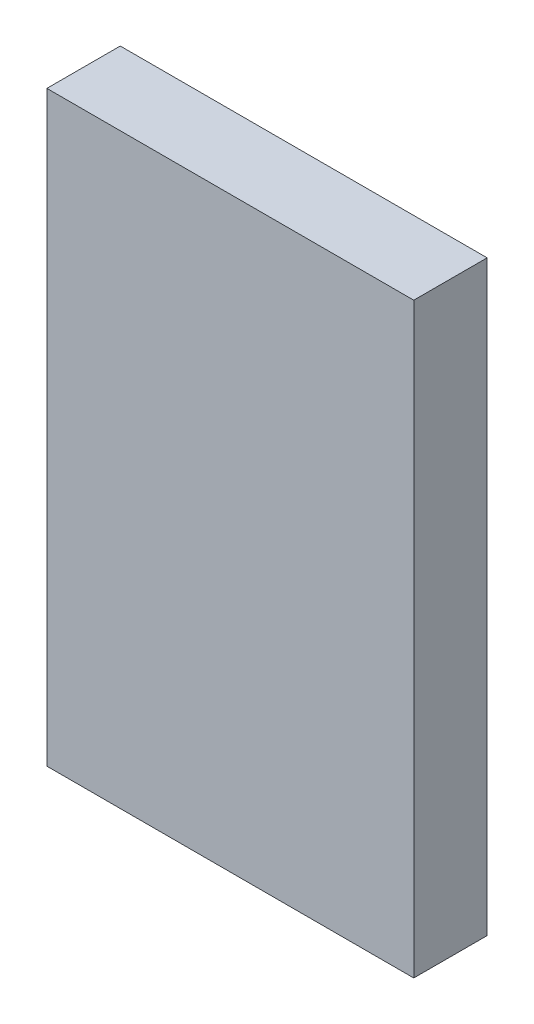
ISO-10303-21;
HEADER;
FILE_DESCRIPTION(('STEP AP214'),'2;1');
FILE_NAME('part.step','',(''),(''),'','','');
FILE_SCHEMA(('AUTOMOTIVE_DESIGN { 1 0 10303 214 1 1 1 1 }'));
ENDSEC;
DATA;
#1=APPLICATION_CONTEXT('core data for automotive mechanical design processes');
#2=APPLICATION_PROTOCOL_DEFINITION('international standard','automotive_design',2000,#1);
#3=PRODUCT_CONTEXT('',#1,'mechanical');
#4=PRODUCT('Part','Part','',(#3));
#5=PRODUCT_RELATED_PRODUCT_CATEGORY('part','',(#4));
#6=PRODUCT_DEFINITION_FORMATION('','',#4);
#7=PRODUCT_DEFINITION_CONTEXT('part definition',#1,'design');
#8=PRODUCT_DEFINITION('design','',#6,#7);
#9=PRODUCT_DEFINITION_SHAPE('','',#8);
#10=(LENGTH_UNIT() NAMED_UNIT(*) SI_UNIT(.MILLI.,.METRE.));
#11=(NAMED_UNIT(*) PLANE_ANGLE_UNIT() SI_UNIT($,.RADIAN.));
#12=(NAMED_UNIT(*) SI_UNIT($,.STERADIAN.) SOLID_ANGLE_UNIT());
#13=UNCERTAINTY_MEASURE_WITH_UNIT(LENGTH_MEASURE(1.E-05),#10,'distance_accuracy_value','');
#14=(GEOMETRIC_REPRESENTATION_CONTEXT(3) GLOBAL_UNCERTAINTY_ASSIGNED_CONTEXT((#13)) GLOBAL_UNIT_ASSIGNED_CONTEXT((#10,
#11,#12)) REPRESENTATION_CONTEXT('',''));
#15=CARTESIAN_POINT('',(0.,0.,0.));
#16=DIRECTION('',(0.,0.,1.));
#17=DIRECTION('',(1.,0.,0.));
#18=AXIS2_PLACEMENT_3D('',#15,#16,#17);
#19=CARTESIAN_POINT('',(-0.2499995,0.40000174,0.));
#20=DIRECTION('',(0.,0.,1.));
#21=DIRECTION('',(1.,0.,0.));
#22=AXIS2_PLACEMENT_3D('',#19,#20,#21);
#23=PLANE('',#22);
#24=DIRECTION('',(1.,0.,0.));
#25=VECTOR('',#24,1.);
#26=CARTESIAN_POINT('',(0.2499995,-0.3999992,0.));
#27=LINE('',#26,#25);
#28=CARTESIAN_POINT('',(-0.2499995,-0.3999992,0.));
#29=VERTEX_POINT('',#28);
#30=CARTESIAN_POINT('',(0.2499995,-0.3999992,0.));
#31=VERTEX_POINT('',#30);
#32=EDGE_CURVE('E79',#29,#31,#27,.T.);
#33=ORIENTED_EDGE('',*,*,#32,.F.);
#34=DIRECTION('',(0.,1.,0.));
#35=VECTOR('',#34,1.);
#36=CARTESIAN_POINT('',(-0.2499995,-0.3999992,0.));
#37=LINE('',#36,#35);
#38=CARTESIAN_POINT('',(-0.2499995,0.40000174,0.));
#39=VERTEX_POINT('',#38);
#40=EDGE_CURVE('E67',#39,#29,#37,.F.);
#41=ORIENTED_EDGE('',*,*,#40,.F.);
#42=DIRECTION('',(1.,0.,0.));
#43=VECTOR('',#42,1.);
#44=CARTESIAN_POINT('',(-0.2499995,0.40000174,0.));
#45=LINE('',#44,#43);
#46=CARTESIAN_POINT('',(0.2499995,0.40000174,0.));
#47=VERTEX_POINT('',#46);
#48=EDGE_CURVE('E54',#47,#39,#45,.F.);
#49=ORIENTED_EDGE('',*,*,#48,.F.);
#50=DIRECTION('',(0.,1.,0.));
#51=VECTOR('',#50,1.);
#52=CARTESIAN_POINT('',(0.2499995,0.40000174,0.));
#53=LINE('',#52,#51);
#54=EDGE_CURVE('E19',#31,#47,#53,.T.);
#55=ORIENTED_EDGE('',*,*,#54,.F.);
#56=EDGE_LOOP('',(#33,#41,#49,#55));
#57=FACE_BOUND('',#56,.T.);
#58=ADVANCED_FACE('F16',(#57),#23,.F.);
#59=CARTESIAN_POINT('',(0.2499995,0.40000174,0.));
#60=DIRECTION('',(1.,0.,0.));
#61=DIRECTION('',(0.,0.,-1.));
#62=AXIS2_PLACEMENT_3D('',#59,#60,#61);
#63=PLANE('',#62);
#64=DIRECTION('',(0.,0.,1.));
#65=VECTOR('',#64,1.);
#66=CARTESIAN_POINT('',(0.2499995,0.40000174,0.));
#67=LINE('',#66,#65);
#68=CARTESIAN_POINT('',(0.2499995,0.40000174,0.1));
#69=VERTEX_POINT('',#68);
#70=EDGE_CURVE('E60',#69,#47,#67,.F.);
#71=ORIENTED_EDGE('',*,*,#70,.F.);
#72=DIRECTION('',(0.,1.,0.));
#73=VECTOR('',#72,1.);
#74=CARTESIAN_POINT('',(0.2499995,0.40000174,0.1));
#75=LINE('',#74,#73);
#76=CARTESIAN_POINT('',(0.2499995,-0.3999992,0.1));
#77=VERTEX_POINT('',#76);
#78=EDGE_CURVE('E82',#77,#69,#75,.T.);
#79=ORIENTED_EDGE('',*,*,#78,.F.);
#80=DIRECTION('',(0.,0.,-1.));
#81=VECTOR('',#80,1.);
#82=CARTESIAN_POINT('',(0.2499995,-0.3999992,0.));
#83=LINE('',#82,#81);
#84=EDGE_CURVE('E63',#31,#77,#83,.F.);
#85=ORIENTED_EDGE('',*,*,#84,.F.);
#86=ORIENTED_EDGE('',*,*,#54,.T.);
#87=EDGE_LOOP('',(#71,#79,#85,#86));
#88=FACE_BOUND('',#87,.T.);
#89=ADVANCED_FACE('F59',(#88),#63,.T.);
#90=CARTESIAN_POINT('',(-0.2499995,0.40000174,0.));
#91=DIRECTION('',(0.,1.,0.));
#92=DIRECTION('',(0.,0.,1.));
#93=AXIS2_PLACEMENT_3D('',#90,#91,#92);
#94=PLANE('',#93);
#95=DIRECTION('',(0.,0.,1.));
#96=VECTOR('',#95,1.);
#97=CARTESIAN_POINT('',(-0.2499995,0.40000174,0.));
#98=LINE('',#97,#96);
#99=CARTESIAN_POINT('',(-0.2499995,0.40000174,0.1));
#100=VERTEX_POINT('',#99);
#101=EDGE_CURVE('E69',#100,#39,#98,.F.);
#102=ORIENTED_EDGE('',*,*,#101,.F.);
#103=DIRECTION('',(1.,0.,0.));
#104=VECTOR('',#103,1.);
#105=CARTESIAN_POINT('',(-0.2499995,0.40000174,0.1));
#106=LINE('',#105,#104);
#107=EDGE_CURVE('E73',#69,#100,#106,.F.);
#108=ORIENTED_EDGE('',*,*,#107,.F.);
#109=ORIENTED_EDGE('',*,*,#70,.T.);
#110=ORIENTED_EDGE('',*,*,#48,.T.);
#111=EDGE_LOOP('',(#102,#108,#109,#110));
#112=FACE_BOUND('',#111,.T.);
#113=ADVANCED_FACE('F71',(#112),#94,.T.);
#114=CARTESIAN_POINT('',(-0.2499995,-0.3999992,0.));
#115=DIRECTION('',(-1.,0.,0.));
#116=DIRECTION('',(0.,0.,1.));
#117=AXIS2_PLACEMENT_3D('',#114,#115,#116);
#118=PLANE('',#117);
#119=DIRECTION('',(0.,0.,-1.));
#120=VECTOR('',#119,1.);
#121=CARTESIAN_POINT('',(-0.2499995,-0.3999992,0.));
#122=LINE('',#121,#120);
#123=CARTESIAN_POINT('',(-0.2499995,-0.3999992,0.1));
#124=VERTEX_POINT('',#123);
#125=EDGE_CURVE('E34',#124,#29,#122,.T.);
#126=ORIENTED_EDGE('',*,*,#125,.F.);
#127=DIRECTION('',(0.,1.,0.));
#128=VECTOR('',#127,1.);
#129=CARTESIAN_POINT('',(-0.2499995,0.40000174,0.1));
#130=LINE('',#129,#128);
#131=EDGE_CURVE('E25',#100,#124,#130,.F.);
#132=ORIENTED_EDGE('',*,*,#131,.F.);
#133=ORIENTED_EDGE('',*,*,#101,.T.);
#134=ORIENTED_EDGE('',*,*,#40,.T.);
#135=EDGE_LOOP('',(#126,#132,#133,#134));
#136=FACE_BOUND('',#135,.T.);
#137=ADVANCED_FACE('F88',(#136),#118,.T.);
#138=CARTESIAN_POINT('',(0.2499995,-0.3999992,0.));
#139=DIRECTION('',(0.,-1.,0.));
#140=DIRECTION('',(0.,0.,-1.));
#141=AXIS2_PLACEMENT_3D('',#138,#139,#140);
#142=PLANE('',#141);
#143=ORIENTED_EDGE('',*,*,#84,.T.);
#144=DIRECTION('',(1.,0.,0.));
#145=VECTOR('',#144,1.);
#146=CARTESIAN_POINT('',(-0.2499995,-0.3999992,0.1));
#147=LINE('',#146,#145);
#148=EDGE_CURVE('E11',#124,#77,#147,.T.);
#149=ORIENTED_EDGE('',*,*,#148,.F.);
#150=ORIENTED_EDGE('',*,*,#125,.T.);
#151=ORIENTED_EDGE('',*,*,#32,.T.);
#152=EDGE_LOOP('',(#143,#149,#150,#151));
#153=FACE_BOUND('',#152,.T.);
#154=ADVANCED_FACE('F90',(#153),#142,.T.);
#155=CARTESIAN_POINT('',(-0.2499995,0.40000174,0.1));
#156=DIRECTION('',(0.,0.,1.));
#157=DIRECTION('',(1.,0.,0.));
#158=AXIS2_PLACEMENT_3D('',#155,#156,#157);
#159=PLANE('',#158);
#160=ORIENTED_EDGE('',*,*,#131,.T.);
#161=ORIENTED_EDGE('',*,*,#148,.T.);
#162=ORIENTED_EDGE('',*,*,#78,.T.);
#163=ORIENTED_EDGE('',*,*,#107,.T.);
#164=EDGE_LOOP('',(#160,#161,#162,#163));
#165=FACE_BOUND('',#164,.T.);
#166=ADVANCED_FACE('F87',(#165),#159,.T.);
#167=CLOSED_SHELL('',(#58,#89,#113,#137,#154,#166));
#168=MANIFOLD_SOLID_BREP('B1',#167);
#169=ADVANCED_BREP_SHAPE_REPRESENTATION('',(#18,#168),#14);
#170=SHAPE_DEFINITION_REPRESENTATION(#9,#169);
ENDSEC;
END-ISO-10303-21;
